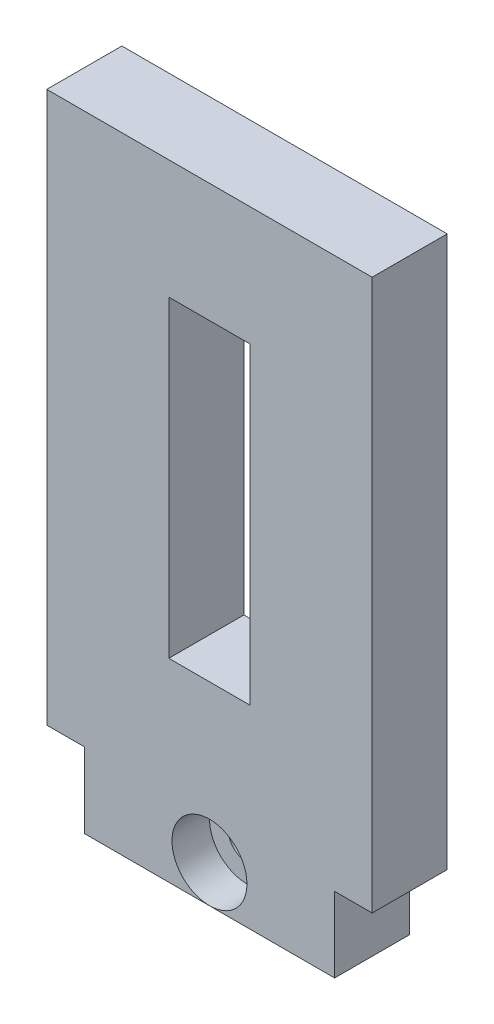
ISO-10303-21;
HEADER;
FILE_DESCRIPTION(('STEP AP214'),'2;1');
FILE_NAME('part.step','',(''),(''),'','','');
FILE_SCHEMA(('AUTOMOTIVE_DESIGN { 1 0 10303 214 1 1 1 1 }'));
ENDSEC;
DATA;
#1=APPLICATION_CONTEXT('core data for automotive mechanical design processes');
#2=APPLICATION_PROTOCOL_DEFINITION('international standard','automotive_design',2000,#1);
#3=PRODUCT_CONTEXT('',#1,'mechanical');
#4=PRODUCT('Part','Part','',(#3));
#5=PRODUCT_RELATED_PRODUCT_CATEGORY('part','',(#4));
#6=PRODUCT_DEFINITION_FORMATION('','',#4);
#7=PRODUCT_DEFINITION_CONTEXT('part definition',#1,'design');
#8=PRODUCT_DEFINITION('design','',#6,#7);
#9=PRODUCT_DEFINITION_SHAPE('','',#8);
#10=(LENGTH_UNIT() NAMED_UNIT(*) SI_UNIT(.MILLI.,.METRE.));
#11=(NAMED_UNIT(*) PLANE_ANGLE_UNIT() SI_UNIT($,.RADIAN.));
#12=(NAMED_UNIT(*) SI_UNIT($,.STERADIAN.) SOLID_ANGLE_UNIT());
#13=UNCERTAINTY_MEASURE_WITH_UNIT(LENGTH_MEASURE(1.E-05),#10,'distance_accuracy_value','');
#14=(GEOMETRIC_REPRESENTATION_CONTEXT(3) GLOBAL_UNCERTAINTY_ASSIGNED_CONTEXT((#13)) GLOBAL_UNIT_ASSIGNED_CONTEXT((#10,
#11,#12)) REPRESENTATION_CONTEXT('',''));
#15=CARTESIAN_POINT('',(0.,0.,0.));
#16=DIRECTION('',(0.,0.,1.));
#17=DIRECTION('',(1.,0.,0.));
#18=AXIS2_PLACEMENT_3D('',#15,#16,#17);
#19=CARTESIAN_POINT('',(22.,-3.,0.));
#20=DIRECTION('',(0.,0.,1.));
#21=DIRECTION('',(1.,0.,0.));
#22=AXIS2_PLACEMENT_3D('',#19,#20,#21);
#23=CYLINDRICAL_SURFACE('',#22,1.5);
#24=CARTESIAN_POINT('',(22.,-3.,0.));
#25=DIRECTION('',(0.,0.,1.));
#26=DIRECTION('',(1.,0.,0.));
#27=AXIS2_PLACEMENT_3D('',#24,#25,#26);
#28=CIRCLE('',#27,1.5);
#29=CARTESIAN_POINT('',(23.5,-3.,0.));
#30=VERTEX_POINT('',#29);
#31=EDGE_CURVE('E230',#30,#30,#28,.T.);
#32=ORIENTED_EDGE('',*,*,#31,.F.);
#33=EDGE_LOOP('',(#32));
#34=FACE_BOUND('',#33,.T.);
#35=CARTESIAN_POINT('',(22.,-3.,3.));
#36=DIRECTION('',(0.,0.,1.));
#37=DIRECTION('',(1.,0.,0.));
#38=AXIS2_PLACEMENT_3D('',#35,#36,#37);
#39=CIRCLE('',#38,1.5);
#40=CARTESIAN_POINT('',(23.5,-3.,3.));
#41=VERTEX_POINT('',#40);
#42=EDGE_CURVE('E37',#41,#41,#39,.F.);
#43=ORIENTED_EDGE('',*,*,#42,.F.);
#44=EDGE_LOOP('',(#43));
#45=FACE_BOUND('',#44,.T.);
#46=ADVANCED_FACE('F33',(#34,#45),#23,.F.);
#47=CARTESIAN_POINT('',(0.,0.,6.));
#48=DIRECTION('',(0.,1.,0.));
#49=DIRECTION('',(0.,0.,1.));
#50=AXIS2_PLACEMENT_3D('',#47,#48,#49);
#51=PLANE('',#50);
#52=DIRECTION('',(1.,0.,0.));
#53=VECTOR('',#52,1.);
#54=CARTESIAN_POINT('',(0.,0.,0.));
#55=LINE('',#54,#53);
#56=CARTESIAN_POINT('',(32.,0.,0.));
#57=VERTEX_POINT('',#56);
#58=CARTESIAN_POINT('',(35.,0.,0.));
#59=VERTEX_POINT('',#58);
#60=EDGE_CURVE('E144',#57,#59,#55,.T.);
#61=ORIENTED_EDGE('',*,*,#60,.T.);
#62=DIRECTION('',(0.,0.,1.));
#63=VECTOR('',#62,1.);
#64=CARTESIAN_POINT('',(35.,0.,0.));
#65=LINE('',#64,#63);
#66=CARTESIAN_POINT('',(35.,0.,6.));
#67=VERTEX_POINT('',#66);
#68=EDGE_CURVE('E50',#59,#67,#65,.T.);
#69=ORIENTED_EDGE('',*,*,#68,.T.);
#70=DIRECTION('',(1.,0.,0.));
#71=VECTOR('',#70,1.);
#72=CARTESIAN_POINT('',(0.,0.,6.));
#73=LINE('',#72,#71);
#74=CARTESIAN_POINT('',(32.,0.,6.));
#75=VERTEX_POINT('',#74);
#76=EDGE_CURVE('E139',#75,#67,#73,.T.);
#77=ORIENTED_EDGE('',*,*,#76,.F.);
#78=DIRECTION('',(0.,0.,1.));
#79=VECTOR('',#78,1.);
#80=CARTESIAN_POINT('',(32.,0.,0.));
#81=LINE('',#80,#79);
#82=EDGE_CURVE('E172',#57,#75,#81,.T.);
#83=ORIENTED_EDGE('',*,*,#82,.F.);
#84=EDGE_LOOP('',(#61,#69,#77,#83));
#85=FACE_BOUND('',#84,.T.);
#86=ADVANCED_FACE('F228',(#85),#51,.F.);
#87=CARTESIAN_POINT('',(8.99999999999999,0.,6.));
#88=VERTEX_POINT('',#87);
#89=CARTESIAN_POINT('',(12.,0.,6.));
#90=VERTEX_POINT('',#89);
#91=EDGE_CURVE('E42',#88,#90,#73,.T.);
#92=ORIENTED_EDGE('',*,*,#91,.F.);
#93=DIRECTION('',(0.,0.,1.));
#94=VECTOR('',#93,1.);
#95=CARTESIAN_POINT('',(8.99999999999999,0.,0.));
#96=LINE('',#95,#94);
#97=CARTESIAN_POINT('',(8.99999999999999,0.,0.));
#98=VERTEX_POINT('',#97);
#99=EDGE_CURVE('E238',#98,#88,#96,.T.);
#100=ORIENTED_EDGE('',*,*,#99,.F.);
#101=CARTESIAN_POINT('',(12.,0.,0.));
#102=VERTEX_POINT('',#101);
#103=EDGE_CURVE('E140',#98,#102,#55,.T.);
#104=ORIENTED_EDGE('',*,*,#103,.T.);
#105=DIRECTION('',(0.,0.,1.));
#106=VECTOR('',#105,1.);
#107=CARTESIAN_POINT('',(12.,0.,0.));
#108=LINE('',#107,#106);
#109=EDGE_CURVE('E149',#102,#90,#108,.T.);
#110=ORIENTED_EDGE('',*,*,#109,.T.);
#111=EDGE_LOOP('',(#92,#100,#104,#110));
#112=FACE_BOUND('',#111,.T.);
#113=ADVANCED_FACE('F35',(#112),#51,.F.);
#114=CARTESIAN_POINT('',(0.,44.,6.));
#115=DIRECTION('',(0.,-1.,0.));
#116=DIRECTION('',(0.,0.,-1.));
#117=AXIS2_PLACEMENT_3D('',#114,#115,#116);
#118=PLANE('',#117);
#119=DIRECTION('',(-1.,0.,0.));
#120=VECTOR('',#119,1.);
#121=CARTESIAN_POINT('',(0.,44.,6.));
#122=LINE('',#121,#120);
#123=CARTESIAN_POINT('',(35.,44.,6.));
#124=VERTEX_POINT('',#123);
#125=CARTESIAN_POINT('',(8.99999999999999,44.,6.));
#126=VERTEX_POINT('',#125);
#127=EDGE_CURVE('E11',#124,#126,#122,.T.);
#128=ORIENTED_EDGE('',*,*,#127,.F.);
#129=DIRECTION('',(0.,0.,1.));
#130=VECTOR('',#129,1.);
#131=CARTESIAN_POINT('',(35.,44.,0.));
#132=LINE('',#131,#130);
#133=CARTESIAN_POINT('',(35.,44.,0.));
#134=VERTEX_POINT('',#133);
#135=EDGE_CURVE('E124',#134,#124,#132,.T.);
#136=ORIENTED_EDGE('',*,*,#135,.F.);
#137=DIRECTION('',(-1.,0.,0.));
#138=VECTOR('',#137,1.);
#139=CARTESIAN_POINT('',(0.,44.,0.));
#140=LINE('',#139,#138);
#141=CARTESIAN_POINT('',(8.99999999999999,44.,0.));
#142=VERTEX_POINT('',#141);
#143=EDGE_CURVE('E58',#134,#142,#140,.T.);
#144=ORIENTED_EDGE('',*,*,#143,.T.);
#145=DIRECTION('',(0.,0.,1.));
#146=VECTOR('',#145,1.);
#147=CARTESIAN_POINT('',(8.99999999999999,44.,0.));
#148=LINE('',#147,#146);
#149=EDGE_CURVE('E240',#142,#126,#148,.T.);
#150=ORIENTED_EDGE('',*,*,#149,.T.);
#151=EDGE_LOOP('',(#128,#136,#144,#150));
#152=FACE_BOUND('',#151,.T.);
#153=ADVANCED_FACE('F132',(#152),#118,.F.);
#154=CARTESIAN_POINT('',(0.,0.,6.));
#155=DIRECTION('',(0.,0.,-1.));
#156=DIRECTION('',(-1.,0.,0.));
#157=AXIS2_PLACEMENT_3D('',#154,#155,#156);
#158=PLANE('',#157);
#159=CARTESIAN_POINT('',(22.,-3.,6.));
#160=DIRECTION('',(0.,0.,1.));
#161=DIRECTION('',(1.,0.,0.));
#162=AXIS2_PLACEMENT_3D('',#159,#160,#161);
#163=CIRCLE('',#162,2.995);
#164=CARTESIAN_POINT('',(24.995,-3.,6.));
#165=VERTEX_POINT('',#164);
#166=EDGE_CURVE('E356',#165,#165,#163,.T.);
#167=ORIENTED_EDGE('',*,*,#166,.F.);
#168=EDGE_LOOP('',(#167));
#169=FACE_BOUND('',#168,.T.);
#170=DIRECTION('',(1.,0.,0.));
#171=VECTOR('',#170,1.);
#172=CARTESIAN_POINT('',(18.75,9.5,6.));
#173=LINE('',#172,#171);
#174=CARTESIAN_POINT('',(18.75,9.5,6.));
#175=VERTEX_POINT('',#174);
#176=CARTESIAN_POINT('',(25.25,9.5,6.));
#177=VERTEX_POINT('',#176);
#178=EDGE_CURVE('E256',#175,#177,#173,.T.);
#179=ORIENTED_EDGE('',*,*,#178,.F.);
#180=DIRECTION('',(0.,-1.,0.));
#181=VECTOR('',#180,1.);
#182=CARTESIAN_POINT('',(18.75,34.5,6.));
#183=LINE('',#182,#181);
#184=CARTESIAN_POINT('',(18.75,34.5,6.));
#185=VERTEX_POINT('',#184);
#186=EDGE_CURVE('E242',#185,#175,#183,.T.);
#187=ORIENTED_EDGE('',*,*,#186,.F.);
#188=DIRECTION('',(-1.,0.,0.));
#189=VECTOR('',#188,1.);
#190=CARTESIAN_POINT('',(18.75,34.5,6.));
#191=LINE('',#190,#189);
#192=CARTESIAN_POINT('',(25.25,34.5,6.));
#193=VERTEX_POINT('',#192);
#194=EDGE_CURVE('E210',#193,#185,#191,.T.);
#195=ORIENTED_EDGE('',*,*,#194,.F.);
#196=DIRECTION('',(0.,1.,0.));
#197=VECTOR('',#196,1.);
#198=CARTESIAN_POINT('',(25.25,34.5,6.));
#199=LINE('',#198,#197);
#200=EDGE_CURVE('E258',#177,#193,#199,.T.);
#201=ORIENTED_EDGE('',*,*,#200,.F.);
#202=EDGE_LOOP('',(#179,#187,#195,#201));
#203=FACE_BOUND('',#202,.T.);
#204=ORIENTED_EDGE('',*,*,#76,.T.);
#205=DIRECTION('',(0.,-1.,0.));
#206=VECTOR('',#205,1.);
#207=CARTESIAN_POINT('',(35.,44.,6.));
#208=LINE('',#207,#206);
#209=EDGE_CURVE('E129',#124,#67,#208,.T.);
#210=ORIENTED_EDGE('',*,*,#209,.F.);
#211=ORIENTED_EDGE('',*,*,#127,.T.);
#212=DIRECTION('',(0.,1.,0.));
#213=VECTOR('',#212,1.);
#214=CARTESIAN_POINT('',(8.99999999999999,44.,6.));
#215=LINE('',#214,#213);
#216=EDGE_CURVE('E235',#88,#126,#215,.T.);
#217=ORIENTED_EDGE('',*,*,#216,.F.);
#218=ORIENTED_EDGE('',*,*,#91,.T.);
#219=DIRECTION('',(0.,-1.,0.));
#220=VECTOR('',#219,1.);
#221=CARTESIAN_POINT('',(12.,0.,6.));
#222=LINE('',#221,#220);
#223=CARTESIAN_POINT('',(12.,-6.,6.));
#224=VERTEX_POINT('',#223);
#225=EDGE_CURVE('E152',#90,#224,#222,.T.);
#226=ORIENTED_EDGE('',*,*,#225,.T.);
#227=DIRECTION('',(1.,0.,0.));
#228=VECTOR('',#227,1.);
#229=CARTESIAN_POINT('',(12.,-6.,6.));
#230=LINE('',#229,#228);
#231=CARTESIAN_POINT('',(32.,-6.,6.));
#232=VERTEX_POINT('',#231);
#233=EDGE_CURVE('E166',#224,#232,#230,.T.);
#234=ORIENTED_EDGE('',*,*,#233,.T.);
#235=DIRECTION('',(0.,1.,0.));
#236=VECTOR('',#235,1.);
#237=CARTESIAN_POINT('',(32.,0.,6.));
#238=LINE('',#237,#236);
#239=EDGE_CURVE('E162',#232,#75,#238,.T.);
#240=ORIENTED_EDGE('',*,*,#239,.T.);
#241=EDGE_LOOP('',(#204,#210,#211,#217,#218,#226,#234,#240));
#242=FACE_BOUND('',#241,.T.);
#243=ADVANCED_FACE('F198',(#169,#203,#242),#158,.F.);
#244=CARTESIAN_POINT('',(0.,0.,0.));
#245=DIRECTION('',(0.,0.,-1.));
#246=DIRECTION('',(-1.,0.,0.));
#247=AXIS2_PLACEMENT_3D('',#244,#245,#246);
#248=PLANE('',#247);
#249=ORIENTED_EDGE('',*,*,#31,.T.);
#250=EDGE_LOOP('',(#249));
#251=FACE_BOUND('',#250,.T.);
#252=DIRECTION('',(0.,-1.,0.));
#253=VECTOR('',#252,1.);
#254=CARTESIAN_POINT('',(35.,44.,0.));
#255=LINE('',#254,#253);
#256=EDGE_CURVE('E122',#134,#59,#255,.T.);
#257=ORIENTED_EDGE('',*,*,#256,.T.);
#258=ORIENTED_EDGE('',*,*,#60,.F.);
#259=DIRECTION('',(0.,1.,0.));
#260=VECTOR('',#259,1.);
#261=CARTESIAN_POINT('',(32.,0.,0.));
#262=LINE('',#261,#260);
#263=CARTESIAN_POINT('',(32.,-6.,0.));
#264=VERTEX_POINT('',#263);
#265=EDGE_CURVE('E169',#264,#57,#262,.T.);
#266=ORIENTED_EDGE('',*,*,#265,.F.);
#267=DIRECTION('',(1.,0.,0.));
#268=VECTOR('',#267,1.);
#269=CARTESIAN_POINT('',(12.,-6.,0.));
#270=LINE('',#269,#268);
#271=CARTESIAN_POINT('',(12.,-6.,0.));
#272=VERTEX_POINT('',#271);
#273=EDGE_CURVE('E171',#272,#264,#270,.T.);
#274=ORIENTED_EDGE('',*,*,#273,.F.);
#275=DIRECTION('',(0.,-1.,0.));
#276=VECTOR('',#275,1.);
#277=CARTESIAN_POINT('',(12.,0.,0.));
#278=LINE('',#277,#276);
#279=EDGE_CURVE('E165',#102,#272,#278,.T.);
#280=ORIENTED_EDGE('',*,*,#279,.F.);
#281=ORIENTED_EDGE('',*,*,#103,.F.);
#282=DIRECTION('',(0.,1.,0.));
#283=VECTOR('',#282,1.);
#284=CARTESIAN_POINT('',(8.99999999999999,44.,0.));
#285=LINE('',#284,#283);
#286=EDGE_CURVE('E138',#98,#142,#285,.T.);
#287=ORIENTED_EDGE('',*,*,#286,.T.);
#288=ORIENTED_EDGE('',*,*,#143,.F.);
#289=EDGE_LOOP('',(#257,#258,#266,#274,#280,#281,#287,#288));
#290=FACE_BOUND('',#289,.T.);
#291=DIRECTION('',(0.,-1.,0.));
#292=VECTOR('',#291,1.);
#293=CARTESIAN_POINT('',(18.75,34.5,0.));
#294=LINE('',#293,#292);
#295=CARTESIAN_POINT('',(18.75,34.5,0.));
#296=VERTEX_POINT('',#295);
#297=CARTESIAN_POINT('',(18.75,9.5,0.));
#298=VERTEX_POINT('',#297);
#299=EDGE_CURVE('E244',#296,#298,#294,.T.);
#300=ORIENTED_EDGE('',*,*,#299,.T.);
#301=DIRECTION('',(1.,0.,0.));
#302=VECTOR('',#301,1.);
#303=CARTESIAN_POINT('',(18.75,9.5,0.));
#304=LINE('',#303,#302);
#305=CARTESIAN_POINT('',(25.25,9.5,0.));
#306=VERTEX_POINT('',#305);
#307=EDGE_CURVE('E247',#298,#306,#304,.T.);
#308=ORIENTED_EDGE('',*,*,#307,.T.);
#309=DIRECTION('',(0.,1.,0.));
#310=VECTOR('',#309,1.);
#311=CARTESIAN_POINT('',(25.25,34.5,0.));
#312=LINE('',#311,#310);
#313=CARTESIAN_POINT('',(25.25,34.5,0.));
#314=VERTEX_POINT('',#313);
#315=EDGE_CURVE('E250',#306,#314,#312,.T.);
#316=ORIENTED_EDGE('',*,*,#315,.T.);
#317=DIRECTION('',(-1.,0.,0.));
#318=VECTOR('',#317,1.);
#319=CARTESIAN_POINT('',(18.75,34.5,0.));
#320=LINE('',#319,#318);
#321=EDGE_CURVE('E217',#314,#296,#320,.T.);
#322=ORIENTED_EDGE('',*,*,#321,.T.);
#323=EDGE_LOOP('',(#300,#308,#316,#322));
#324=FACE_BOUND('',#323,.T.);
#325=ADVANCED_FACE('F135',(#251,#290,#324),#248,.T.);
#326=CARTESIAN_POINT('',(12.,0.,0.));
#327=DIRECTION('',(-1.,0.,0.));
#328=DIRECTION('',(0.,0.,1.));
#329=AXIS2_PLACEMENT_3D('',#326,#327,#328);
#330=PLANE('',#329);
#331=ORIENTED_EDGE('',*,*,#225,.F.);
#332=ORIENTED_EDGE('',*,*,#109,.F.);
#333=ORIENTED_EDGE('',*,*,#279,.T.);
#334=DIRECTION('',(0.,0.,1.));
#335=VECTOR('',#334,1.);
#336=CARTESIAN_POINT('',(12.,-6.,0.));
#337=LINE('',#336,#335);
#338=EDGE_CURVE('E156',#272,#224,#337,.T.);
#339=ORIENTED_EDGE('',*,*,#338,.T.);
#340=EDGE_LOOP('',(#331,#332,#333,#339));
#341=FACE_BOUND('',#340,.T.);
#342=ADVANCED_FACE('F189',(#341),#330,.T.);
#343=CARTESIAN_POINT('',(32.,0.,0.));
#344=DIRECTION('',(1.,0.,0.));
#345=DIRECTION('',(0.,0.,-1.));
#346=AXIS2_PLACEMENT_3D('',#343,#344,#345);
#347=PLANE('',#346);
#348=ORIENTED_EDGE('',*,*,#239,.F.);
#349=DIRECTION('',(0.,0.,1.));
#350=VECTOR('',#349,1.);
#351=CARTESIAN_POINT('',(32.,-6.,0.));
#352=LINE('',#351,#350);
#353=EDGE_CURVE('E175',#264,#232,#352,.T.);
#354=ORIENTED_EDGE('',*,*,#353,.F.);
#355=ORIENTED_EDGE('',*,*,#265,.T.);
#356=ORIENTED_EDGE('',*,*,#82,.T.);
#357=EDGE_LOOP('',(#348,#354,#355,#356));
#358=FACE_BOUND('',#357,.T.);
#359=ADVANCED_FACE('F225',(#358),#347,.T.);
#360=CARTESIAN_POINT('',(12.,-6.,0.));
#361=DIRECTION('',(0.,-1.,0.));
#362=DIRECTION('',(0.,0.,-1.));
#363=AXIS2_PLACEMENT_3D('',#360,#361,#362);
#364=PLANE('',#363);
#365=ORIENTED_EDGE('',*,*,#233,.F.);
#366=ORIENTED_EDGE('',*,*,#338,.F.);
#367=ORIENTED_EDGE('',*,*,#273,.T.);
#368=ORIENTED_EDGE('',*,*,#353,.T.);
#369=EDGE_LOOP('',(#365,#366,#367,#368));
#370=FACE_BOUND('',#369,.T.);
#371=ADVANCED_FACE('F196',(#370),#364,.T.);
#372=CARTESIAN_POINT('',(18.75,34.5,0.));
#373=DIRECTION('',(-1.,0.,0.));
#374=DIRECTION('',(0.,-1.,0.));
#375=AXIS2_PLACEMENT_3D('',#372,#373,#374);
#376=PLANE('',#375);
#377=ORIENTED_EDGE('',*,*,#186,.T.);
#378=DIRECTION('',(0.,0.,1.));
#379=VECTOR('',#378,1.);
#380=CARTESIAN_POINT('',(18.75,9.5,0.));
#381=LINE('',#380,#379);
#382=EDGE_CURVE('E214',#298,#175,#381,.T.);
#383=ORIENTED_EDGE('',*,*,#382,.F.);
#384=ORIENTED_EDGE('',*,*,#299,.F.);
#385=DIRECTION('',(0.,0.,1.));
#386=VECTOR('',#385,1.);
#387=CARTESIAN_POINT('',(18.75,34.5,0.));
#388=LINE('',#387,#386);
#389=EDGE_CURVE('E201',#296,#185,#388,.T.);
#390=ORIENTED_EDGE('',*,*,#389,.T.);
#391=EDGE_LOOP('',(#377,#383,#384,#390));
#392=FACE_BOUND('',#391,.T.);
#393=ADVANCED_FACE('F269',(#392),#376,.F.);
#394=CARTESIAN_POINT('',(18.75,34.5,0.));
#395=DIRECTION('',(0.,1.,0.));
#396=DIRECTION('',(0.,0.,1.));
#397=AXIS2_PLACEMENT_3D('',#394,#395,#396);
#398=PLANE('',#397);
#399=ORIENTED_EDGE('',*,*,#194,.T.);
#400=ORIENTED_EDGE('',*,*,#389,.F.);
#401=ORIENTED_EDGE('',*,*,#321,.F.);
#402=DIRECTION('',(0.,0.,1.));
#403=VECTOR('',#402,1.);
#404=CARTESIAN_POINT('',(25.25,34.5,0.));
#405=LINE('',#404,#403);
#406=EDGE_CURVE('E202',#314,#193,#405,.T.);
#407=ORIENTED_EDGE('',*,*,#406,.T.);
#408=EDGE_LOOP('',(#399,#400,#401,#407));
#409=FACE_BOUND('',#408,.T.);
#410=ADVANCED_FACE('F265',(#409),#398,.F.);
#411=CARTESIAN_POINT('',(25.25,34.5,0.));
#412=DIRECTION('',(1.,0.,0.));
#413=DIRECTION('',(0.,1.,0.));
#414=AXIS2_PLACEMENT_3D('',#411,#412,#413);
#415=PLANE('',#414);
#416=ORIENTED_EDGE('',*,*,#200,.T.);
#417=ORIENTED_EDGE('',*,*,#406,.F.);
#418=ORIENTED_EDGE('',*,*,#315,.F.);
#419=DIRECTION('',(0.,0.,1.));
#420=VECTOR('',#419,1.);
#421=CARTESIAN_POINT('',(25.25,9.5,0.));
#422=LINE('',#421,#420);
#423=EDGE_CURVE('E207',#306,#177,#422,.T.);
#424=ORIENTED_EDGE('',*,*,#423,.T.);
#425=EDGE_LOOP('',(#416,#417,#418,#424));
#426=FACE_BOUND('',#425,.T.);
#427=ADVANCED_FACE('F274',(#426),#415,.F.);
#428=CARTESIAN_POINT('',(18.75,9.5,0.));
#429=DIRECTION('',(0.,-1.,0.));
#430=DIRECTION('',(1.,0.,0.));
#431=AXIS2_PLACEMENT_3D('',#428,#429,#430);
#432=PLANE('',#431);
#433=ORIENTED_EDGE('',*,*,#178,.T.);
#434=ORIENTED_EDGE('',*,*,#423,.F.);
#435=ORIENTED_EDGE('',*,*,#307,.F.);
#436=ORIENTED_EDGE('',*,*,#382,.T.);
#437=EDGE_LOOP('',(#433,#434,#435,#436));
#438=FACE_BOUND('',#437,.T.);
#439=ADVANCED_FACE('F272',(#438),#432,.F.);
#440=CARTESIAN_POINT('',(8.99999999999999,44.,0.));
#441=DIRECTION('',(1.,0.,0.));
#442=DIRECTION('',(0.,1.,0.));
#443=AXIS2_PLACEMENT_3D('',#440,#441,#442);
#444=PLANE('',#443);
#445=ORIENTED_EDGE('',*,*,#216,.T.);
#446=ORIENTED_EDGE('',*,*,#149,.F.);
#447=ORIENTED_EDGE('',*,*,#286,.F.);
#448=ORIENTED_EDGE('',*,*,#99,.T.);
#449=EDGE_LOOP('',(#445,#446,#447,#448));
#450=FACE_BOUND('',#449,.T.);
#451=ADVANCED_FACE('F281',(#450),#444,.F.);
#452=CARTESIAN_POINT('',(35.,44.,0.));
#453=DIRECTION('',(-1.,0.,0.));
#454=DIRECTION('',(0.,-1.,0.));
#455=AXIS2_PLACEMENT_3D('',#452,#453,#454);
#456=PLANE('',#455);
#457=ORIENTED_EDGE('',*,*,#209,.T.);
#458=ORIENTED_EDGE('',*,*,#68,.F.);
#459=ORIENTED_EDGE('',*,*,#256,.F.);
#460=ORIENTED_EDGE('',*,*,#135,.T.);
#461=EDGE_LOOP('',(#457,#458,#459,#460));
#462=FACE_BOUND('',#461,.T.);
#463=ADVANCED_FACE('F123',(#462),#456,.F.);
#464=CARTESIAN_POINT('',(22.,-3.,3.));
#465=DIRECTION('',(0.,0.,1.));
#466=DIRECTION('',(1.,0.,0.));
#467=AXIS2_PLACEMENT_3D('',#464,#465,#466);
#468=PLANE('',#467);
#469=CARTESIAN_POINT('',(22.,-3.,3.));
#470=DIRECTION('',(0.,0.,1.));
#471=DIRECTION('',(1.,0.,0.));
#472=AXIS2_PLACEMENT_3D('',#469,#470,#471);
#473=CIRCLE('',#472,2.995);
#474=CARTESIAN_POINT('',(24.995,-3.,3.));
#475=VERTEX_POINT('',#474);
#476=EDGE_CURVE('E353',#475,#475,#473,.T.);
#477=ORIENTED_EDGE('',*,*,#476,.T.);
#478=EDGE_LOOP('',(#477));
#479=FACE_BOUND('',#478,.T.);
#480=ORIENTED_EDGE('',*,*,#42,.T.);
#481=EDGE_LOOP('',(#480));
#482=FACE_BOUND('',#481,.T.);
#483=ADVANCED_FACE('F299',(#479,#482),#468,.T.);
#484=CARTESIAN_POINT('',(22.,-3.,3.));
#485=DIRECTION('',(0.,0.,1.));
#486=DIRECTION('',(1.,0.,0.));
#487=AXIS2_PLACEMENT_3D('',#484,#485,#486);
#488=CYLINDRICAL_SURFACE('',#487,2.995);
#489=ORIENTED_EDGE('',*,*,#476,.F.);
#490=EDGE_LOOP('',(#489));
#491=FACE_BOUND('',#490,.T.);
#492=ORIENTED_EDGE('',*,*,#166,.T.);
#493=EDGE_LOOP('',(#492));
#494=FACE_BOUND('',#493,.T.);
#495=ADVANCED_FACE('F296',(#491,#494),#488,.F.);
#496=CLOSED_SHELL('',(#46,#86,#113,#153,#243,#325,#342,#359,#371,#393,#410,#427,#439,#451,#463,
#483,#495));
#497=MANIFOLD_SOLID_BREP('B2',#496);
#498=ADVANCED_BREP_SHAPE_REPRESENTATION('',(#18,#497),#14);
#499=SHAPE_DEFINITION_REPRESENTATION(#9,#498);
ENDSEC;
END-ISO-10303-21;
